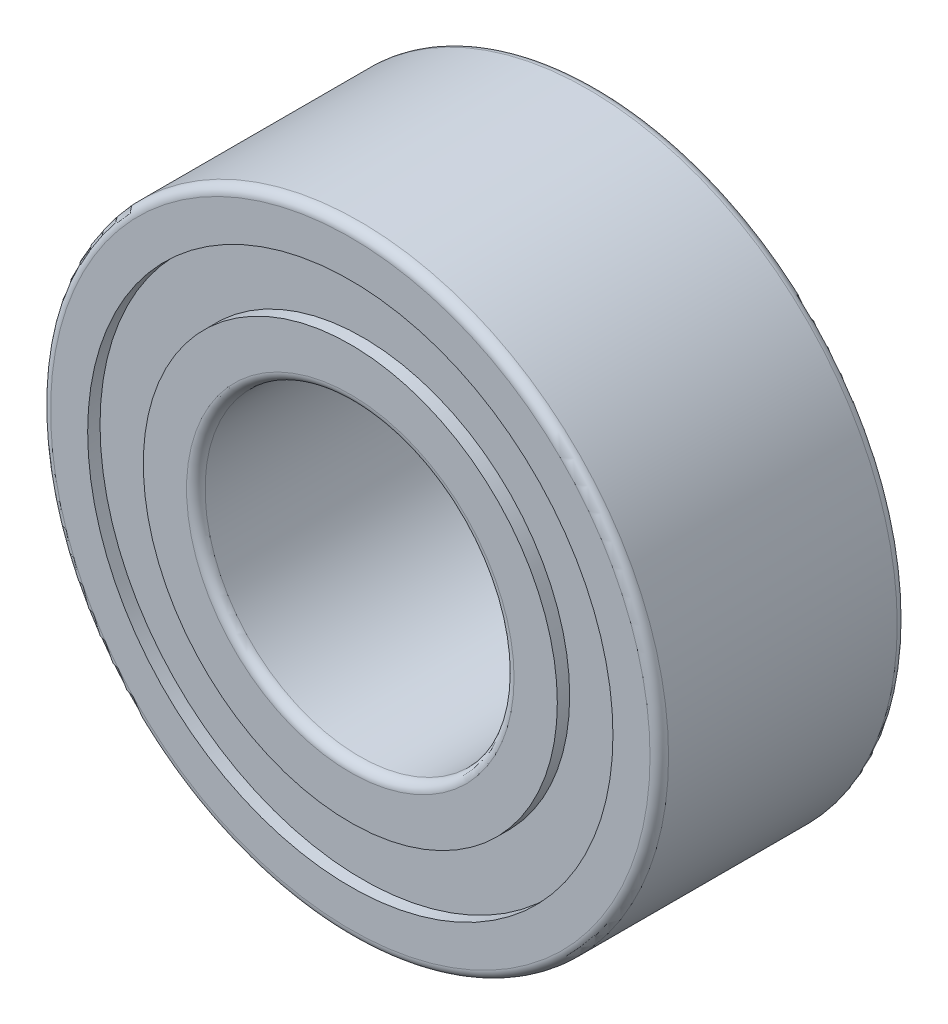
ISO-10303-21;
HEADER;
FILE_DESCRIPTION(('STEP AP214'),'2;1');
FILE_NAME('part.step','',(''),(''),'','','');
FILE_SCHEMA(('AUTOMOTIVE_DESIGN { 1 0 10303 214 1 1 1 1 }'));
ENDSEC;
DATA;
#1=APPLICATION_CONTEXT('core data for automotive mechanical design processes');
#2=APPLICATION_PROTOCOL_DEFINITION('international standard','automotive_design',2000,#1);
#3=PRODUCT_CONTEXT('',#1,'mechanical');
#4=PRODUCT('Part','Part','',(#3));
#5=PRODUCT_RELATED_PRODUCT_CATEGORY('part','',(#4));
#6=PRODUCT_DEFINITION_FORMATION('','',#4);
#7=PRODUCT_DEFINITION_CONTEXT('part definition',#1,'design');
#8=PRODUCT_DEFINITION('design','',#6,#7);
#9=PRODUCT_DEFINITION_SHAPE('','',#8);
#10=(LENGTH_UNIT() NAMED_UNIT(*) SI_UNIT(.MILLI.,.METRE.));
#11=(NAMED_UNIT(*) PLANE_ANGLE_UNIT() SI_UNIT($,.RADIAN.));
#12=(NAMED_UNIT(*) SI_UNIT($,.STERADIAN.) SOLID_ANGLE_UNIT());
#13=UNCERTAINTY_MEASURE_WITH_UNIT(LENGTH_MEASURE(1.E-05),#10,'distance_accuracy_value','');
#14=(GEOMETRIC_REPRESENTATION_CONTEXT(3) GLOBAL_UNCERTAINTY_ASSIGNED_CONTEXT((#13)) GLOBAL_UNIT_ASSIGNED_CONTEXT((#10,
#11,#12)) REPRESENTATION_CONTEXT('',''));
#15=CARTESIAN_POINT('',(0.,0.,0.));
#16=DIRECTION('',(0.,0.,1.));
#17=DIRECTION('',(1.,0.,0.));
#18=AXIS2_PLACEMENT_3D('',#15,#16,#17);
#19=CARTESIAN_POINT('',(0.,0.,-2.00000000000001));
#20=DIRECTION('',(0.,0.,1.));
#21=DIRECTION('',(1.,0.,0.));
#22=AXIS2_PLACEMENT_3D('',#19,#20,#21);
#23=PLANE('',#22);
#24=CARTESIAN_POINT('',(0.,0.,-2.00000000000001));
#25=DIRECTION('',(0.,0.,1.));
#26=DIRECTION('',(1.,0.,0.));
#27=AXIS2_PLACEMENT_3D('',#24,#25,#26);
#28=CIRCLE('',#27,4.85);
#29=CARTESIAN_POINT('',(4.85,0.,-2.00000000000001));
#30=VERTEX_POINT('',#29);
#31=EDGE_CURVE('E43',#30,#30,#28,.F.);
#32=ORIENTED_EDGE('',*,*,#31,.T.);
#33=EDGE_LOOP('',(#32));
#34=FACE_BOUND('',#33,.T.);
#35=CARTESIAN_POINT('',(0.,0.,-2.00000000000001));
#36=DIRECTION('',(0.,0.,1.));
#37=DIRECTION('',(1.,0.,0.));
#38=AXIS2_PLACEMENT_3D('',#35,#36,#37);
#39=CIRCLE('',#38,4.25);
#40=CARTESIAN_POINT('',(4.25,0.,-2.00000000000001));
#41=VERTEX_POINT('',#40);
#42=EDGE_CURVE('E77',#41,#41,#39,.T.);
#43=ORIENTED_EDGE('',*,*,#42,.T.);
#44=EDGE_LOOP('',(#43));
#45=FACE_BOUND('',#44,.T.);
#46=ADVANCED_FACE('F32',(#34,#45),#23,.F.);
#47=CARTESIAN_POINT('',(0.,0.,1.99999999999999));
#48=DIRECTION('',(0.,0.,1.));
#49=DIRECTION('',(1.,0.,0.));
#50=AXIS2_PLACEMENT_3D('',#47,#48,#49);
#51=PLANE('',#50);
#52=CARTESIAN_POINT('',(0.,0.,1.99999999999999));
#53=DIRECTION('',(0.,0.,1.));
#54=DIRECTION('',(1.,0.,0.));
#55=AXIS2_PLACEMENT_3D('',#52,#53,#54);
#56=CIRCLE('',#55,2.65);
#57=CARTESIAN_POINT('',(2.65,0.,1.99999999999999));
#58=VERTEX_POINT('',#57);
#59=EDGE_CURVE('E39',#58,#58,#56,.F.);
#60=ORIENTED_EDGE('',*,*,#59,.T.);
#61=EDGE_LOOP('',(#60));
#62=FACE_BOUND('',#61,.T.);
#63=CARTESIAN_POINT('',(0.,0.,1.99999999999999));
#64=DIRECTION('',(0.,0.,1.));
#65=DIRECTION('',(1.,0.,0.));
#66=AXIS2_PLACEMENT_3D('',#63,#64,#65);
#67=CIRCLE('',#66,3.35);
#68=CARTESIAN_POINT('',(3.35,0.,1.99999999999999));
#69=VERTEX_POINT('',#68);
#70=EDGE_CURVE('E71',#69,#69,#67,.T.);
#71=ORIENTED_EDGE('',*,*,#70,.T.);
#72=EDGE_LOOP('',(#71));
#73=FACE_BOUND('',#72,.T.);
#74=ADVANCED_FACE('F112',(#62,#73),#51,.T.);
#75=CARTESIAN_POINT('',(0.,0.,1.99999999999999));
#76=DIRECTION('',(0.,0.,1.));
#77=DIRECTION('',(1.,0.,0.));
#78=AXIS2_PLACEMENT_3D('',#75,#76,#77);
#79=CIRCLE('',#78,4.85);
#80=CARTESIAN_POINT('',(4.85,0.,1.99999999999999));
#81=VERTEX_POINT('',#80);
#82=EDGE_CURVE('E10',#81,#81,#79,.T.);
#83=ORIENTED_EDGE('',*,*,#82,.T.);
#84=EDGE_LOOP('',(#83));
#85=FACE_BOUND('',#84,.T.);
#86=CARTESIAN_POINT('',(0.,0.,1.99999999999999));
#87=DIRECTION('',(0.,0.,1.));
#88=DIRECTION('',(1.,0.,0.));
#89=AXIS2_PLACEMENT_3D('',#86,#87,#88);
#90=CIRCLE('',#89,4.25);
#91=CARTESIAN_POINT('',(4.25,0.,1.99999999999999));
#92=VERTEX_POINT('',#91);
#93=EDGE_CURVE('E65',#92,#92,#90,.T.);
#94=ORIENTED_EDGE('',*,*,#93,.F.);
#95=EDGE_LOOP('',(#94));
#96=FACE_BOUND('',#95,.T.);
#97=ADVANCED_FACE('F102',(#85,#96),#51,.T.);
#98=CARTESIAN_POINT('',(0.,0.,-2.00000000000001));
#99=DIRECTION('',(0.,0.,1.));
#100=DIRECTION('',(1.,0.,0.));
#101=AXIS2_PLACEMENT_3D('',#98,#99,#100);
#102=CIRCLE('',#101,2.65);
#103=CARTESIAN_POINT('',(2.65,0.,-2.00000000000001));
#104=VERTEX_POINT('',#103);
#105=EDGE_CURVE('E61',#104,#104,#102,.T.);
#106=ORIENTED_EDGE('',*,*,#105,.T.);
#107=EDGE_LOOP('',(#106));
#108=FACE_BOUND('',#107,.T.);
#109=CARTESIAN_POINT('',(0.,0.,-2.00000000000001));
#110=DIRECTION('',(0.,0.,1.));
#111=DIRECTION('',(1.,0.,0.));
#112=AXIS2_PLACEMENT_3D('',#109,#110,#111);
#113=CIRCLE('',#112,3.35);
#114=CARTESIAN_POINT('',(3.35,0.,-2.00000000000001));
#115=VERTEX_POINT('',#114);
#116=EDGE_CURVE('E83',#115,#115,#113,.T.);
#117=ORIENTED_EDGE('',*,*,#116,.F.);
#118=EDGE_LOOP('',(#117));
#119=FACE_BOUND('',#118,.T.);
#120=ADVANCED_FACE('F99',(#108,#119),#23,.F.);
#121=CARTESIAN_POINT('',(0.,0.,1.99999999999999));
#122=DIRECTION('',(0.,0.,-1.));
#123=DIRECTION('',(-1.,0.,0.));
#124=AXIS2_PLACEMENT_3D('',#121,#122,#123);
#125=CYLINDRICAL_SURFACE('',#124,5.);
#126=CARTESIAN_POINT('',(0.,0.,-1.85));
#127=DIRECTION('',(0.,0.,1.));
#128=DIRECTION('',(1.,0.,0.));
#129=AXIS2_PLACEMENT_3D('',#126,#127,#128);
#130=CIRCLE('',#129,5.);
#131=CARTESIAN_POINT('',(5.,0.,-1.85));
#132=VERTEX_POINT('',#131);
#133=EDGE_CURVE('E47',#132,#132,#130,.T.);
#134=ORIENTED_EDGE('',*,*,#133,.T.);
#135=EDGE_LOOP('',(#134));
#136=FACE_BOUND('',#135,.T.);
#137=CARTESIAN_POINT('',(0.,0.,1.84999999999999));
#138=DIRECTION('',(0.,0.,1.));
#139=DIRECTION('',(1.,0.,0.));
#140=AXIS2_PLACEMENT_3D('',#137,#138,#139);
#141=CIRCLE('',#140,5.);
#142=CARTESIAN_POINT('',(5.,0.,1.84999999999999));
#143=VERTEX_POINT('',#142);
#144=EDGE_CURVE('E52',#143,#143,#141,.F.);
#145=ORIENTED_EDGE('',*,*,#144,.T.);
#146=EDGE_LOOP('',(#145));
#147=FACE_BOUND('',#146,.T.);
#148=ADVANCED_FACE('F101',(#136,#147),#125,.T.);
#149=CARTESIAN_POINT('',(0.,0.,1.99999999999999));
#150=DIRECTION('',(0.,0.,-1.));
#151=DIRECTION('',(-1.,0.,0.));
#152=AXIS2_PLACEMENT_3D('',#149,#150,#151);
#153=CYLINDRICAL_SURFACE('',#152,2.5);
#154=CARTESIAN_POINT('',(0.,0.,-1.85));
#155=DIRECTION('',(0.,0.,1.));
#156=DIRECTION('',(1.,0.,0.));
#157=AXIS2_PLACEMENT_3D('',#154,#155,#156);
#158=CIRCLE('',#157,2.5);
#159=CARTESIAN_POINT('',(2.5,0.,-1.85));
#160=VERTEX_POINT('',#159);
#161=EDGE_CURVE('E55',#160,#160,#158,.F.);
#162=ORIENTED_EDGE('',*,*,#161,.T.);
#163=EDGE_LOOP('',(#162));
#164=FACE_BOUND('',#163,.T.);
#165=CARTESIAN_POINT('',(0.,0.,1.84999999999999));
#166=DIRECTION('',(0.,0.,1.));
#167=DIRECTION('',(1.,0.,0.));
#168=AXIS2_PLACEMENT_3D('',#165,#166,#167);
#169=CIRCLE('',#168,2.5);
#170=CARTESIAN_POINT('',(2.5,0.,1.84999999999999));
#171=VERTEX_POINT('',#170);
#172=EDGE_CURVE('E58',#171,#171,#169,.T.);
#173=ORIENTED_EDGE('',*,*,#172,.T.);
#174=EDGE_LOOP('',(#173));
#175=FACE_BOUND('',#174,.T.);
#176=ADVANCED_FACE('F109',(#164,#175),#153,.F.);
#177=CARTESIAN_POINT('',(0.,0.,1.8));
#178=DIRECTION('',(0.,0.,1.));
#179=DIRECTION('',(1.,0.,0.));
#180=AXIS2_PLACEMENT_3D('',#177,#178,#179);
#181=CYLINDRICAL_SURFACE('',#180,4.25);
#182=CARTESIAN_POINT('',(0.,0.,1.8));
#183=DIRECTION('',(0.,0.,1.));
#184=DIRECTION('',(1.,0.,0.));
#185=AXIS2_PLACEMENT_3D('',#182,#183,#184);
#186=CIRCLE('',#185,4.25);
#187=CARTESIAN_POINT('',(4.25,0.,1.8));
#188=VERTEX_POINT('',#187);
#189=EDGE_CURVE('E64',#188,#188,#186,.T.);
#190=ORIENTED_EDGE('',*,*,#189,.F.);
#191=EDGE_LOOP('',(#190));
#192=FACE_BOUND('',#191,.T.);
#193=ORIENTED_EDGE('',*,*,#93,.T.);
#194=EDGE_LOOP('',(#193));
#195=FACE_BOUND('',#194,.T.);
#196=ADVANCED_FACE('F139',(#192,#195),#181,.F.);
#197=CARTESIAN_POINT('',(0.,0.,1.8));
#198=DIRECTION('',(0.,0.,1.));
#199=DIRECTION('',(1.,0.,0.));
#200=AXIS2_PLACEMENT_3D('',#197,#198,#199);
#201=PLANE('',#200);
#202=CARTESIAN_POINT('',(0.,0.,1.8));
#203=DIRECTION('',(0.,0.,1.));
#204=DIRECTION('',(1.,0.,0.));
#205=AXIS2_PLACEMENT_3D('',#202,#203,#204);
#206=CIRCLE('',#205,3.35);
#207=CARTESIAN_POINT('',(3.35,0.,1.8));
#208=VERTEX_POINT('',#207);
#209=EDGE_CURVE('E68',#208,#208,#206,.T.);
#210=ORIENTED_EDGE('',*,*,#209,.F.);
#211=EDGE_LOOP('',(#210));
#212=FACE_BOUND('',#211,.T.);
#213=ORIENTED_EDGE('',*,*,#189,.T.);
#214=EDGE_LOOP('',(#213));
#215=FACE_BOUND('',#214,.T.);
#216=ADVANCED_FACE('F135',(#212,#215),#201,.T.);
#217=CARTESIAN_POINT('',(0.,0.,1.8));
#218=DIRECTION('',(0.,0.,1.));
#219=DIRECTION('',(1.,0.,0.));
#220=AXIS2_PLACEMENT_3D('',#217,#218,#219);
#221=CYLINDRICAL_SURFACE('',#220,3.35);
#222=ORIENTED_EDGE('',*,*,#209,.T.);
#223=EDGE_LOOP('',(#222));
#224=FACE_BOUND('',#223,.T.);
#225=ORIENTED_EDGE('',*,*,#70,.F.);
#226=EDGE_LOOP('',(#225));
#227=FACE_BOUND('',#226,.T.);
#228=ADVANCED_FACE('F129',(#224,#227),#221,.T.);
#229=CARTESIAN_POINT('',(0.,0.,-1.80000000000001));
#230=DIRECTION('',(0.,0.,-1.));
#231=DIRECTION('',(1.,0.,0.));
#232=AXIS2_PLACEMENT_3D('',#229,#230,#231);
#233=PLANE('',#232);
#234=CARTESIAN_POINT('',(0.,0.,-1.80000000000001));
#235=DIRECTION('',(0.,0.,1.));
#236=DIRECTION('',(1.,0.,0.));
#237=AXIS2_PLACEMENT_3D('',#234,#235,#236);
#238=CIRCLE('',#237,4.25);
#239=CARTESIAN_POINT('',(4.25,0.,-1.80000000000001));
#240=VERTEX_POINT('',#239);
#241=EDGE_CURVE('E74',#240,#240,#238,.T.);
#242=ORIENTED_EDGE('',*,*,#241,.F.);
#243=EDGE_LOOP('',(#242));
#244=FACE_BOUND('',#243,.T.);
#245=CARTESIAN_POINT('',(0.,0.,-1.80000000000001));
#246=DIRECTION('',(0.,0.,1.));
#247=DIRECTION('',(1.,0.,0.));
#248=AXIS2_PLACEMENT_3D('',#245,#246,#247);
#249=CIRCLE('',#248,3.35);
#250=CARTESIAN_POINT('',(3.35,0.,-1.80000000000001));
#251=VERTEX_POINT('',#250);
#252=EDGE_CURVE('E80',#251,#251,#249,.T.);
#253=ORIENTED_EDGE('',*,*,#252,.T.);
#254=EDGE_LOOP('',(#253));
#255=FACE_BOUND('',#254,.T.);
#256=ADVANCED_FACE('F89',(#244,#255),#233,.T.);
#257=CARTESIAN_POINT('',(0.,0.,-1.80000000000001));
#258=DIRECTION('',(0.,0.,-1.));
#259=DIRECTION('',(-1.,0.,0.));
#260=AXIS2_PLACEMENT_3D('',#257,#258,#259);
#261=CYLINDRICAL_SURFACE('',#260,4.25);
#262=ORIENTED_EDGE('',*,*,#241,.T.);
#263=EDGE_LOOP('',(#262));
#264=FACE_BOUND('',#263,.T.);
#265=ORIENTED_EDGE('',*,*,#42,.F.);
#266=EDGE_LOOP('',(#265));
#267=FACE_BOUND('',#266,.T.);
#268=ADVANCED_FACE('F95',(#264,#267),#261,.F.);
#269=CARTESIAN_POINT('',(0.,0.,-1.80000000000001));
#270=DIRECTION('',(0.,0.,-1.));
#271=DIRECTION('',(-1.,0.,0.));
#272=AXIS2_PLACEMENT_3D('',#269,#270,#271);
#273=CYLINDRICAL_SURFACE('',#272,3.35);
#274=ORIENTED_EDGE('',*,*,#252,.F.);
#275=EDGE_LOOP('',(#274));
#276=FACE_BOUND('',#275,.T.);
#277=ORIENTED_EDGE('',*,*,#116,.T.);
#278=EDGE_LOOP('',(#277));
#279=FACE_BOUND('',#278,.T.);
#280=ADVANCED_FACE('F91',(#276,#279),#273,.T.);
#281=CARTESIAN_POINT('',(0.,0.,-1.85));
#282=DIRECTION('',(0.,0.,1.));
#283=DIRECTION('',(1.,0.,0.));
#284=AXIS2_PLACEMENT_3D('',#281,#282,#283);
#285=TOROIDAL_SURFACE('',#284,2.65,0.15);
#286=ORIENTED_EDGE('',*,*,#161,.F.);
#287=EDGE_LOOP('',(#286));
#288=FACE_BOUND('',#287,.T.);
#289=ORIENTED_EDGE('',*,*,#105,.F.);
#290=EDGE_LOOP('',(#289));
#291=FACE_BOUND('',#290,.T.);
#292=ADVANCED_FACE('F94',(#288,#291),#285,.T.);
#293=CARTESIAN_POINT('',(0.,0.,-1.85));
#294=DIRECTION('',(0.,0.,1.));
#295=DIRECTION('',(1.,0.,0.));
#296=AXIS2_PLACEMENT_3D('',#293,#294,#295);
#297=TOROIDAL_SURFACE('',#296,4.85,0.15);
#298=ORIENTED_EDGE('',*,*,#31,.F.);
#299=EDGE_LOOP('',(#298));
#300=FACE_BOUND('',#299,.T.);
#301=ORIENTED_EDGE('',*,*,#133,.F.);
#302=EDGE_LOOP('',(#301));
#303=FACE_BOUND('',#302,.T.);
#304=ADVANCED_FACE('F154',(#300,#303),#297,.T.);
#305=CARTESIAN_POINT('',(0.,0.,1.84999999999999));
#306=DIRECTION('',(0.,0.,1.));
#307=DIRECTION('',(1.,0.,0.));
#308=AXIS2_PLACEMENT_3D('',#305,#306,#307);
#309=TOROIDAL_SURFACE('',#308,2.65,0.15);
#310=ORIENTED_EDGE('',*,*,#59,.F.);
#311=EDGE_LOOP('',(#310));
#312=FACE_BOUND('',#311,.T.);
#313=ORIENTED_EDGE('',*,*,#172,.F.);
#314=EDGE_LOOP('',(#313));
#315=FACE_BOUND('',#314,.T.);
#316=ADVANCED_FACE('F152',(#312,#315),#309,.T.);
#317=CARTESIAN_POINT('',(0.,0.,1.84999999999999));
#318=DIRECTION('',(0.,0.,1.));
#319=DIRECTION('',(1.,0.,0.));
#320=AXIS2_PLACEMENT_3D('',#317,#318,#319);
#321=TOROIDAL_SURFACE('',#320,4.85,0.15);
#322=ORIENTED_EDGE('',*,*,#144,.F.);
#323=EDGE_LOOP('',(#322));
#324=FACE_BOUND('',#323,.T.);
#325=ORIENTED_EDGE('',*,*,#82,.F.);
#326=EDGE_LOOP('',(#325));
#327=FACE_BOUND('',#326,.T.);
#328=ADVANCED_FACE('F34',(#324,#327),#321,.T.);
#329=CLOSED_SHELL('',(#46,#74,#97,#120,#148,#176,#196,#216,#228,#256,#268,#280,#292,#304,#316,#328));
#330=MANIFOLD_SOLID_BREP('B2',#329);
#331=ADVANCED_BREP_SHAPE_REPRESENTATION('',(#18,#330),#14);
#332=SHAPE_DEFINITION_REPRESENTATION(#9,#331);
ENDSEC;
END-ISO-10303-21;
